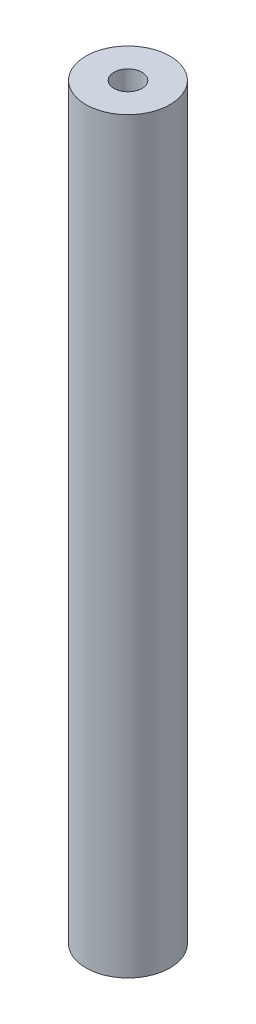
ISO-10303-21;
HEADER;
FILE_DESCRIPTION(('STEP AP214'),'2;1');
FILE_NAME('part.step','',(''),(''),'','','');
FILE_SCHEMA(('AUTOMOTIVE_DESIGN { 1 0 10303 214 1 1 1 1 }'));
ENDSEC;
DATA;
#1=APPLICATION_CONTEXT('core data for automotive mechanical design processes');
#2=APPLICATION_PROTOCOL_DEFINITION('international standard','automotive_design',2000,#1);
#3=PRODUCT_CONTEXT('',#1,'mechanical');
#4=PRODUCT('Part','Part','',(#3));
#5=PRODUCT_RELATED_PRODUCT_CATEGORY('part','',(#4));
#6=PRODUCT_DEFINITION_FORMATION('','',#4);
#7=PRODUCT_DEFINITION_CONTEXT('part definition',#1,'design');
#8=PRODUCT_DEFINITION('design','',#6,#7);
#9=PRODUCT_DEFINITION_SHAPE('','',#8);
#10=(LENGTH_UNIT() NAMED_UNIT(*) SI_UNIT(.MILLI.,.METRE.));
#11=(NAMED_UNIT(*) PLANE_ANGLE_UNIT() SI_UNIT($,.RADIAN.));
#12=(NAMED_UNIT(*) SI_UNIT($,.STERADIAN.) SOLID_ANGLE_UNIT());
#13=UNCERTAINTY_MEASURE_WITH_UNIT(LENGTH_MEASURE(1.E-05),#10,'distance_accuracy_value','');
#14=(GEOMETRIC_REPRESENTATION_CONTEXT(3) GLOBAL_UNCERTAINTY_ASSIGNED_CONTEXT((#13)) GLOBAL_UNIT_ASSIGNED_CONTEXT((#10,
#11,#12)) REPRESENTATION_CONTEXT('',''));
#15=CARTESIAN_POINT('',(0.,0.,0.));
#16=DIRECTION('',(0.,0.,1.));
#17=DIRECTION('',(1.,0.,0.));
#18=AXIS2_PLACEMENT_3D('',#15,#16,#17);
#19=CARTESIAN_POINT('',(0.,80.,0.));
#20=DIRECTION('',(0.,-1.,0.));
#21=DIRECTION('',(0.,0.,-1.));
#22=AXIS2_PLACEMENT_3D('',#19,#20,#21);
#23=CYLINDRICAL_SURFACE('',#22,4.5);
#24=CARTESIAN_POINT('',(0.,80.,0.));
#25=DIRECTION('',(0.,1.,0.));
#26=DIRECTION('',(0.,0.,1.));
#27=AXIS2_PLACEMENT_3D('',#24,#25,#26);
#28=CIRCLE('',#27,4.5);
#29=CARTESIAN_POINT('',(0.,80.,4.5));
#30=VERTEX_POINT('',#29);
#31=EDGE_CURVE('E10',#30,#30,#28,.T.);
#32=ORIENTED_EDGE('',*,*,#31,.F.);
#33=EDGE_LOOP('',(#32));
#34=FACE_BOUND('',#33,.T.);
#35=CARTESIAN_POINT('',(0.,0.,0.));
#36=DIRECTION('',(0.,1.,0.));
#37=DIRECTION('',(0.,0.,1.));
#38=AXIS2_PLACEMENT_3D('',#35,#36,#37);
#39=CIRCLE('',#38,4.5);
#40=CARTESIAN_POINT('',(0.,0.,4.5));
#41=VERTEX_POINT('',#40);
#42=EDGE_CURVE('E35',#41,#41,#39,.T.);
#43=ORIENTED_EDGE('',*,*,#42,.T.);
#44=EDGE_LOOP('',(#43));
#45=FACE_BOUND('',#44,.T.);
#46=ADVANCED_FACE('F32',(#34,#45),#23,.T.);
#47=CARTESIAN_POINT('',(0.,80.,0.));
#48=DIRECTION('',(0.,1.,0.));
#49=DIRECTION('',(0.,0.,1.));
#50=AXIS2_PLACEMENT_3D('',#47,#48,#49);
#51=PLANE('',#50);
#52=CARTESIAN_POINT('',(0.,80.,0.));
#53=DIRECTION('',(0.,1.,0.));
#54=DIRECTION('',(0.,0.,1.));
#55=AXIS2_PLACEMENT_3D('',#52,#53,#54);
#56=CIRCLE('',#55,1.5);
#57=CARTESIAN_POINT('',(0.,80.,1.5));
#58=VERTEX_POINT('',#57);
#59=EDGE_CURVE('E44',#58,#58,#56,.T.);
#60=ORIENTED_EDGE('',*,*,#59,.F.);
#61=EDGE_LOOP('',(#60));
#62=FACE_BOUND('',#61,.T.);
#63=ORIENTED_EDGE('',*,*,#31,.T.);
#64=EDGE_LOOP('',(#63));
#65=FACE_BOUND('',#64,.T.);
#66=ADVANCED_FACE('F69',(#62,#65),#51,.T.);
#67=CARTESIAN_POINT('',(0.,0.,0.));
#68=DIRECTION('',(0.,1.,0.));
#69=DIRECTION('',(0.,0.,1.));
#70=AXIS2_PLACEMENT_3D('',#67,#68,#69);
#71=PLANE('',#70);
#72=CARTESIAN_POINT('',(0.,0.,0.));
#73=DIRECTION('',(0.,-1.,0.));
#74=DIRECTION('',(0.,0.,-1.));
#75=AXIS2_PLACEMENT_3D('',#72,#73,#74);
#76=CIRCLE('',#75,1.5);
#77=CARTESIAN_POINT('',(0.,0.,-1.5));
#78=VERTEX_POINT('',#77);
#79=EDGE_CURVE('E50',#78,#78,#76,.T.);
#80=ORIENTED_EDGE('',*,*,#79,.F.);
#81=EDGE_LOOP('',(#80));
#82=FACE_BOUND('',#81,.T.);
#83=ORIENTED_EDGE('',*,*,#42,.F.);
#84=EDGE_LOOP('',(#83));
#85=FACE_BOUND('',#84,.T.);
#86=ADVANCED_FACE('F65',(#82,#85),#71,.F.);
#87=CARTESIAN_POINT('',(0.,70.,0.));
#88=DIRECTION('',(0.,1.,0.));
#89=DIRECTION('',(0.,0.,1.));
#90=AXIS2_PLACEMENT_3D('',#87,#88,#89);
#91=CYLINDRICAL_SURFACE('',#90,1.5);
#92=CARTESIAN_POINT('',(0.,70.,0.));
#93=DIRECTION('',(0.,1.,0.));
#94=DIRECTION('',(0.,0.,1.));
#95=AXIS2_PLACEMENT_3D('',#92,#93,#94);
#96=CIRCLE('',#95,1.5);
#97=CARTESIAN_POINT('',(0.,70.,1.5));
#98=VERTEX_POINT('',#97);
#99=EDGE_CURVE('E42',#98,#98,#96,.T.);
#100=ORIENTED_EDGE('',*,*,#99,.F.);
#101=EDGE_LOOP('',(#100));
#102=FACE_BOUND('',#101,.T.);
#103=ORIENTED_EDGE('',*,*,#59,.T.);
#104=EDGE_LOOP('',(#103));
#105=FACE_BOUND('',#104,.T.);
#106=ADVANCED_FACE('F68',(#102,#105),#91,.F.);
#107=CARTESIAN_POINT('',(0.,70.,0.));
#108=DIRECTION('',(0.,1.,0.));
#109=DIRECTION('',(0.,0.,1.));
#110=AXIS2_PLACEMENT_3D('',#107,#108,#109);
#111=PLANE('',#110);
#112=ORIENTED_EDGE('',*,*,#99,.T.);
#113=EDGE_LOOP('',(#112));
#114=FACE_BOUND('',#113,.T.);
#115=ADVANCED_FACE('F61',(#114),#111,.T.);
#116=CARTESIAN_POINT('',(0.,10.,0.));
#117=DIRECTION('',(0.,-1.,0.));
#118=DIRECTION('',(0.,0.,-1.));
#119=AXIS2_PLACEMENT_3D('',#116,#117,#118);
#120=CYLINDRICAL_SURFACE('',#119,1.5);
#121=CARTESIAN_POINT('',(0.,10.,0.));
#122=DIRECTION('',(0.,-1.,0.));
#123=DIRECTION('',(0.,0.,-1.));
#124=AXIS2_PLACEMENT_3D('',#121,#122,#123);
#125=CIRCLE('',#124,1.5);
#126=CARTESIAN_POINT('',(0.,10.,-1.5));
#127=VERTEX_POINT('',#126);
#128=EDGE_CURVE('E47',#127,#127,#125,.T.);
#129=ORIENTED_EDGE('',*,*,#128,.F.);
#130=EDGE_LOOP('',(#129));
#131=FACE_BOUND('',#130,.T.);
#132=ORIENTED_EDGE('',*,*,#79,.T.);
#133=EDGE_LOOP('',(#132));
#134=FACE_BOUND('',#133,.T.);
#135=ADVANCED_FACE('F58',(#131,#134),#120,.F.);
#136=CARTESIAN_POINT('',(0.,10.,0.));
#137=DIRECTION('',(0.,-1.,0.));
#138=DIRECTION('',(0.,0.,-1.));
#139=AXIS2_PLACEMENT_3D('',#136,#137,#138);
#140=PLANE('',#139);
#141=ORIENTED_EDGE('',*,*,#128,.T.);
#142=EDGE_LOOP('',(#141));
#143=FACE_BOUND('',#142,.T.);
#144=ADVANCED_FACE('F56',(#143),#140,.T.);
#145=CLOSED_SHELL('',(#46,#66,#86,#106,#115,#135,#144));
#146=MANIFOLD_SOLID_BREP('B2',#145);
#147=ADVANCED_BREP_SHAPE_REPRESENTATION('',(#18,#146),#14);
#148=SHAPE_DEFINITION_REPRESENTATION(#9,#147);
ENDSEC;
END-ISO-10303-21;
